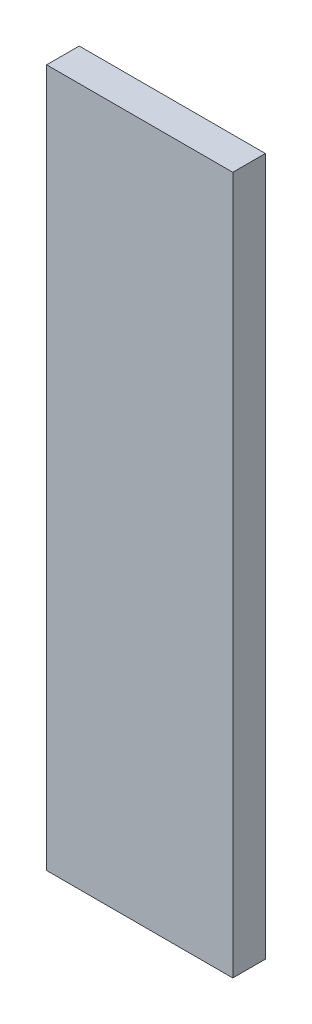
ISO-10303-21;
HEADER;
FILE_DESCRIPTION(('STEP AP214'),'2;1');
FILE_NAME('part.step','',(''),(''),'','','');
FILE_SCHEMA(('AUTOMOTIVE_DESIGN { 1 0 10303 214 1 1 1 1 }'));
ENDSEC;
DATA;
#1=APPLICATION_CONTEXT('core data for automotive mechanical design processes');
#2=APPLICATION_PROTOCOL_DEFINITION('international standard','automotive_design',2000,#1);
#3=PRODUCT_CONTEXT('',#1,'mechanical');
#4=PRODUCT('Part','Part','',(#3));
#5=PRODUCT_RELATED_PRODUCT_CATEGORY('part','',(#4));
#6=PRODUCT_DEFINITION_FORMATION('','',#4);
#7=PRODUCT_DEFINITION_CONTEXT('part definition',#1,'design');
#8=PRODUCT_DEFINITION('design','',#6,#7);
#9=PRODUCT_DEFINITION_SHAPE('','',#8);
#10=(LENGTH_UNIT() NAMED_UNIT(*) SI_UNIT(.MILLI.,.METRE.));
#11=(NAMED_UNIT(*) PLANE_ANGLE_UNIT() SI_UNIT($,.RADIAN.));
#12=(NAMED_UNIT(*) SI_UNIT($,.STERADIAN.) SOLID_ANGLE_UNIT());
#13=UNCERTAINTY_MEASURE_WITH_UNIT(LENGTH_MEASURE(1.E-05),#10,'distance_accuracy_value','');
#14=(GEOMETRIC_REPRESENTATION_CONTEXT(3) GLOBAL_UNCERTAINTY_ASSIGNED_CONTEXT((#13)) GLOBAL_UNIT_ASSIGNED_CONTEXT((#10,
#11,#12)) REPRESENTATION_CONTEXT('',''));
#15=CARTESIAN_POINT('',(0.,0.,0.));
#16=DIRECTION('',(0.,0.,1.));
#17=DIRECTION('',(1.,0.,0.));
#18=AXIS2_PLACEMENT_3D('',#15,#16,#17);
#19=CARTESIAN_POINT('',(-18.13941,68.00215,6.35));
#20=DIRECTION('',(1.,0.,0.));
#21=DIRECTION('',(0.,1.,0.));
#22=AXIS2_PLACEMENT_3D('',#19,#20,#21);
#23=PLANE('',#22);
#24=DIRECTION('',(0.,-1.,0.));
#25=VECTOR('',#24,1.);
#26=CARTESIAN_POINT('',(-18.13941,68.00215,0.));
#27=LINE('',#26,#25);
#28=CARTESIAN_POINT('',(-18.13941,68.00215,0.));
#29=VERTEX_POINT('',#28);
#30=CARTESIAN_POINT('',(-18.13941,-68.00215,0.));
#31=VERTEX_POINT('',#30);
#32=EDGE_CURVE('E114',#29,#31,#27,.T.);
#33=ORIENTED_EDGE('',*,*,#32,.T.);
#34=DIRECTION('',(0.,0.,-1.));
#35=VECTOR('',#34,1.);
#36=CARTESIAN_POINT('',(-18.13941,-68.00215,6.35));
#37=LINE('',#36,#35);
#38=CARTESIAN_POINT('',(-18.13941,-68.00215,6.35));
#39=VERTEX_POINT('',#38);
#40=EDGE_CURVE('E11',#39,#31,#37,.T.);
#41=ORIENTED_EDGE('',*,*,#40,.F.);
#42=DIRECTION('',(0.,-1.,0.));
#43=VECTOR('',#42,1.);
#44=CARTESIAN_POINT('',(-18.13941,68.00215,6.35));
#45=LINE('',#44,#43);
#46=CARTESIAN_POINT('',(-18.13941,68.00215,6.35));
#47=VERTEX_POINT('',#46);
#48=EDGE_CURVE('E115',#47,#39,#45,.T.);
#49=ORIENTED_EDGE('',*,*,#48,.F.);
#50=DIRECTION('',(0.,0.,-1.));
#51=VECTOR('',#50,1.);
#52=CARTESIAN_POINT('',(-18.13941,68.00215,6.35));
#53=LINE('',#52,#51);
#54=EDGE_CURVE('E121',#47,#29,#53,.T.);
#55=ORIENTED_EDGE('',*,*,#54,.T.);
#56=EDGE_LOOP('',(#33,#41,#49,#55));
#57=FACE_BOUND('',#56,.T.);
#58=ADVANCED_FACE('F31',(#57),#23,.F.);
#59=CARTESIAN_POINT('',(-18.13941,-68.00215,6.35));
#60=DIRECTION('',(0.,1.,0.));
#61=DIRECTION('',(0.,0.,1.));
#62=AXIS2_PLACEMENT_3D('',#59,#60,#61);
#63=PLANE('',#62);
#64=CARTESIAN_POINT('',(11.7894100000325,-68.00215,3.1749999999998));
#65=DIRECTION('',(0.,-1.,0.));
#66=DIRECTION('',(0.,0.,-1.));
#67=AXIS2_PLACEMENT_3D('',#64,#65,#66);
#68=CIRCLE('',#67,1.2573);
#69=CARTESIAN_POINT('',(11.7894100000325,-68.00215,1.9176999999998));
#70=VERTEX_POINT('',#69);
#71=EDGE_CURVE('E160',#70,#70,#68,.T.);
#72=ORIENTED_EDGE('',*,*,#71,.F.);
#73=EDGE_LOOP('',(#72));
#74=FACE_BOUND('',#73,.T.);
#75=CARTESIAN_POINT('',(-13.1787899999682,-68.00215,3.1749999999998));
#76=DIRECTION('',(0.,-1.,0.));
#77=DIRECTION('',(0.,0.,-1.));
#78=AXIS2_PLACEMENT_3D('',#75,#76,#77);
#79=CIRCLE('',#78,1.2573);
#80=CARTESIAN_POINT('',(-13.1787899999682,-68.00215,1.9176999999998));
#81=VERTEX_POINT('',#80);
#82=EDGE_CURVE('E95',#81,#81,#79,.T.);
#83=ORIENTED_EDGE('',*,*,#82,.F.);
#84=EDGE_LOOP('',(#83));
#85=FACE_BOUND('',#84,.T.);
#86=DIRECTION('',(1.,0.,0.));
#87=VECTOR('',#86,1.);
#88=CARTESIAN_POINT('',(-18.13941,-68.00215,0.));
#89=LINE('',#88,#87);
#90=CARTESIAN_POINT('',(18.13941,-68.00215,0.));
#91=VERTEX_POINT('',#90);
#92=EDGE_CURVE('E124',#31,#91,#89,.T.);
#93=ORIENTED_EDGE('',*,*,#92,.T.);
#94=DIRECTION('',(0.,0.,-1.));
#95=VECTOR('',#94,1.);
#96=CARTESIAN_POINT('',(18.13941,-68.00215,6.35));
#97=LINE('',#96,#95);
#98=CARTESIAN_POINT('',(18.13941,-68.00215,6.35));
#99=VERTEX_POINT('',#98);
#100=EDGE_CURVE('E39',#99,#91,#97,.T.);
#101=ORIENTED_EDGE('',*,*,#100,.F.);
#102=DIRECTION('',(1.,0.,0.));
#103=VECTOR('',#102,1.);
#104=CARTESIAN_POINT('',(-18.13941,-68.00215,6.35));
#105=LINE('',#104,#103);
#106=EDGE_CURVE('E78',#39,#99,#105,.T.);
#107=ORIENTED_EDGE('',*,*,#106,.F.);
#108=ORIENTED_EDGE('',*,*,#40,.T.);
#109=EDGE_LOOP('',(#93,#101,#107,#108));
#110=FACE_BOUND('',#109,.T.);
#111=ADVANCED_FACE('F147',(#74,#85,#110),#63,.F.);
#112=CARTESIAN_POINT('',(18.13941,68.00215,6.35));
#113=DIRECTION('',(-1.,0.,0.));
#114=DIRECTION('',(0.,-1.,0.));
#115=AXIS2_PLACEMENT_3D('',#112,#113,#114);
#116=PLANE('',#115);
#117=DIRECTION('',(0.,1.,0.));
#118=VECTOR('',#117,1.);
#119=CARTESIAN_POINT('',(18.13941,68.00215,0.));
#120=LINE('',#119,#118);
#121=CARTESIAN_POINT('',(18.13941,68.00215,0.));
#122=VERTEX_POINT('',#121);
#123=EDGE_CURVE('E65',#91,#122,#120,.T.);
#124=ORIENTED_EDGE('',*,*,#123,.T.);
#125=DIRECTION('',(0.,0.,-1.));
#126=VECTOR('',#125,1.);
#127=CARTESIAN_POINT('',(18.13941,68.00215,6.35));
#128=LINE('',#127,#126);
#129=CARTESIAN_POINT('',(18.13941,68.00215,6.35));
#130=VERTEX_POINT('',#129);
#131=EDGE_CURVE('E129',#130,#122,#128,.T.);
#132=ORIENTED_EDGE('',*,*,#131,.F.);
#133=DIRECTION('',(0.,1.,0.));
#134=VECTOR('',#133,1.);
#135=CARTESIAN_POINT('',(18.13941,68.00215,6.35));
#136=LINE('',#135,#134);
#137=EDGE_CURVE('E118',#99,#130,#136,.T.);
#138=ORIENTED_EDGE('',*,*,#137,.F.);
#139=ORIENTED_EDGE('',*,*,#100,.T.);
#140=EDGE_LOOP('',(#124,#132,#138,#139));
#141=FACE_BOUND('',#140,.T.);
#142=ADVANCED_FACE('F131',(#141),#116,.F.);
#143=CARTESIAN_POINT('',(-18.13941,68.00215,6.35));
#144=DIRECTION('',(0.,-1.,0.));
#145=DIRECTION('',(0.,0.,-1.));
#146=AXIS2_PLACEMENT_3D('',#143,#144,#145);
#147=PLANE('',#146);
#148=DIRECTION('',(-1.,0.,0.));
#149=VECTOR('',#148,1.);
#150=CARTESIAN_POINT('',(-18.13941,68.00215,0.));
#151=LINE('',#150,#149);
#152=EDGE_CURVE('E71',#122,#29,#151,.T.);
#153=ORIENTED_EDGE('',*,*,#152,.T.);
#154=ORIENTED_EDGE('',*,*,#54,.F.);
#155=DIRECTION('',(-1.,0.,0.));
#156=VECTOR('',#155,1.);
#157=CARTESIAN_POINT('',(-18.13941,68.00215,6.35));
#158=LINE('',#157,#156);
#159=EDGE_CURVE('E47',#130,#47,#158,.T.);
#160=ORIENTED_EDGE('',*,*,#159,.F.);
#161=ORIENTED_EDGE('',*,*,#131,.T.);
#162=EDGE_LOOP('',(#153,#154,#160,#161));
#163=FACE_BOUND('',#162,.T.);
#164=ADVANCED_FACE('F138',(#163),#147,.F.);
#165=CARTESIAN_POINT('',(-18.13941,-68.00215,6.35));
#166=DIRECTION('',(0.,0.,1.));
#167=DIRECTION('',(1.,0.,0.));
#168=AXIS2_PLACEMENT_3D('',#165,#166,#167);
#169=PLANE('',#168);
#170=ORIENTED_EDGE('',*,*,#48,.T.);
#171=ORIENTED_EDGE('',*,*,#106,.T.);
#172=ORIENTED_EDGE('',*,*,#137,.T.);
#173=ORIENTED_EDGE('',*,*,#159,.T.);
#174=EDGE_LOOP('',(#170,#171,#172,#173));
#175=FACE_BOUND('',#174,.T.);
#176=ADVANCED_FACE('F140',(#175),#169,.T.);
#177=CARTESIAN_POINT('',(-18.13941,-68.00215,0.));
#178=DIRECTION('',(0.,0.,1.));
#179=DIRECTION('',(1.,0.,0.));
#180=AXIS2_PLACEMENT_3D('',#177,#178,#179);
#181=PLANE('',#180);
#182=ORIENTED_EDGE('',*,*,#32,.F.);
#183=ORIENTED_EDGE('',*,*,#152,.F.);
#184=ORIENTED_EDGE('',*,*,#123,.F.);
#185=ORIENTED_EDGE('',*,*,#92,.F.);
#186=EDGE_LOOP('',(#182,#183,#184,#185));
#187=FACE_BOUND('',#186,.T.);
#188=ADVANCED_FACE('F134',(#187),#181,.F.);
#189=CARTESIAN_POINT('',(-13.1787899999682,-58.85815,3.1749999999998));
#190=DIRECTION('',(0.,-1.,0.));
#191=DIRECTION('',(0.,0.,-1.));
#192=AXIS2_PLACEMENT_3D('',#189,#190,#191);
#193=CONICAL_SURFACE('',#192,0.996949999999996,1.02974425867665);
#194=CARTESIAN_POINT('',(-13.1787899999682,-58.2591220058605,3.1749999999998));
#195=VERTEX_POINT('',#194);
#196=VERTEX_LOOP('',#195);
#197=FACE_BOUND('',#196,.T.);
#198=CARTESIAN_POINT('',(-13.1787899999682,-58.85815,3.1749999999998));
#199=DIRECTION('',(0.,-1.,0.));
#200=DIRECTION('',(0.,0.,-1.));
#201=AXIS2_PLACEMENT_3D('',#198,#199,#200);
#202=CIRCLE('',#201,0.996949999999996);
#203=CARTESIAN_POINT('',(-13.1787899999682,-58.85815,2.17804999999981));
#204=VERTEX_POINT('',#203);
#205=EDGE_CURVE('E111',#204,#204,#202,.T.);
#206=ORIENTED_EDGE('',*,*,#205,.T.);
#207=EDGE_LOOP('',(#206));
#208=FACE_BOUND('',#207,.T.);
#209=ADVANCED_FACE('F178',(#197,#208),#193,.F.);
#210=CARTESIAN_POINT('',(-13.1787899999682,-68.00215,3.1749999999998));
#211=DIRECTION('',(0.,-1.,0.));
#212=DIRECTION('',(0.,0.,-1.));
#213=AXIS2_PLACEMENT_3D('',#210,#211,#212);
#214=CYLINDRICAL_SURFACE('',#213,0.996949999999998);
#215=ORIENTED_EDGE('',*,*,#205,.F.);
#216=EDGE_LOOP('',(#215));
#217=FACE_BOUND('',#216,.T.);
#218=CARTESIAN_POINT('',(-13.1787899999682,-60.38215,3.1749999999998));
#219=DIRECTION('',(0.,-1.,0.));
#220=DIRECTION('',(0.,0.,-1.));
#221=AXIS2_PLACEMENT_3D('',#218,#219,#220);
#222=CIRCLE('',#221,0.99695);
#223=CARTESIAN_POINT('',(-13.1787899999682,-60.38215,2.1780499999998));
#224=VERTEX_POINT('',#223);
#225=EDGE_CURVE('E108',#224,#224,#222,.T.);
#226=ORIENTED_EDGE('',*,*,#225,.T.);
#227=EDGE_LOOP('',(#226));
#228=FACE_BOUND('',#227,.T.);
#229=ADVANCED_FACE('F170',(#217,#228),#214,.F.);
#230=CARTESIAN_POINT('',(-12.1818399999682,-60.38215,3.1749999999998));
#231=DIRECTION('',(0.,1.,0.));
#232=DIRECTION('',(0.,0.,1.));
#233=AXIS2_PLACEMENT_3D('',#230,#231,#232);
#234=PLANE('',#233);
#235=ORIENTED_EDGE('',*,*,#225,.F.);
#236=EDGE_LOOP('',(#235));
#237=FACE_BOUND('',#236,.T.);
#238=CARTESIAN_POINT('',(-13.1787899999682,-60.38215,3.1749999999998));
#239=DIRECTION('',(0.,-1.,0.));
#240=DIRECTION('',(0.,0.,-1.));
#241=AXIS2_PLACEMENT_3D('',#238,#239,#240);
#242=CIRCLE('',#241,1.2573);
#243=CARTESIAN_POINT('',(-13.1787899999682,-60.38215,1.9176999999998));
#244=VERTEX_POINT('',#243);
#245=EDGE_CURVE('E99',#244,#244,#242,.T.);
#246=ORIENTED_EDGE('',*,*,#245,.T.);
#247=EDGE_LOOP('',(#246));
#248=FACE_BOUND('',#247,.T.);
#249=ADVANCED_FACE('F164',(#237,#248),#234,.F.);
#250=CARTESIAN_POINT('',(-13.1787899999682,-68.00215,3.1749999999998));
#251=DIRECTION('',(0.,-1.,0.));
#252=DIRECTION('',(0.,0.,-1.));
#253=AXIS2_PLACEMENT_3D('',#250,#251,#252);
#254=CYLINDRICAL_SURFACE('',#253,1.2573);
#255=ORIENTED_EDGE('',*,*,#245,.F.);
#256=EDGE_LOOP('',(#255));
#257=FACE_BOUND('',#256,.T.);
#258=ORIENTED_EDGE('',*,*,#82,.T.);
#259=EDGE_LOOP('',(#258));
#260=FACE_BOUND('',#259,.T.);
#261=ADVANCED_FACE('F89',(#257,#260),#254,.F.);
#262=CARTESIAN_POINT('',(11.7894100000325,-58.85815,3.1749999999998));
#263=DIRECTION('',(0.,-1.,0.));
#264=DIRECTION('',(0.,0.,-1.));
#265=AXIS2_PLACEMENT_3D('',#262,#263,#264);
#266=CONICAL_SURFACE('',#265,0.996949999999996,1.02974425867665);
#267=CARTESIAN_POINT('',(11.7894100000325,-58.2591220058605,3.1749999999998));
#268=VERTEX_POINT('',#267);
#269=VERTEX_LOOP('',#268);
#270=FACE_BOUND('',#269,.T.);
#271=CARTESIAN_POINT('',(11.7894100000325,-58.85815,3.1749999999998));
#272=DIRECTION('',(0.,-1.,0.));
#273=DIRECTION('',(0.,0.,-1.));
#274=AXIS2_PLACEMENT_3D('',#271,#272,#273);
#275=CIRCLE('',#274,0.996949999999996);
#276=CARTESIAN_POINT('',(11.7894100000325,-58.85815,2.17804999999981));
#277=VERTEX_POINT('',#276);
#278=EDGE_CURVE('E93',#277,#277,#275,.T.);
#279=ORIENTED_EDGE('',*,*,#278,.T.);
#280=EDGE_LOOP('',(#279));
#281=FACE_BOUND('',#280,.T.);
#282=ADVANCED_FACE('F85',(#270,#281),#266,.F.);
#283=CARTESIAN_POINT('',(11.7894100000325,-68.00215,3.1749999999998));
#284=DIRECTION('',(0.,-1.,0.));
#285=DIRECTION('',(0.,0.,-1.));
#286=AXIS2_PLACEMENT_3D('',#283,#284,#285);
#287=CYLINDRICAL_SURFACE('',#286,0.996949999999998);
#288=ORIENTED_EDGE('',*,*,#278,.F.);
#289=EDGE_LOOP('',(#288));
#290=FACE_BOUND('',#289,.T.);
#291=CARTESIAN_POINT('',(11.7894100000325,-60.38215,3.1749999999998));
#292=DIRECTION('',(0.,-1.,0.));
#293=DIRECTION('',(0.,0.,-1.));
#294=AXIS2_PLACEMENT_3D('',#291,#292,#293);
#295=CIRCLE('',#294,0.99695);
#296=CARTESIAN_POINT('',(11.7894100000325,-60.38215,2.1780499999998));
#297=VERTEX_POINT('',#296);
#298=EDGE_CURVE('E96',#297,#297,#295,.T.);
#299=ORIENTED_EDGE('',*,*,#298,.T.);
#300=EDGE_LOOP('',(#299));
#301=FACE_BOUND('',#300,.T.);
#302=ADVANCED_FACE('F88',(#290,#301),#287,.F.);
#303=CARTESIAN_POINT('',(12.7863600000325,-60.38215,3.1749999999998));
#304=DIRECTION('',(0.,1.,0.));
#305=DIRECTION('',(0.,0.,1.));
#306=AXIS2_PLACEMENT_3D('',#303,#304,#305);
#307=PLANE('',#306);
#308=ORIENTED_EDGE('',*,*,#298,.F.);
#309=EDGE_LOOP('',(#308));
#310=FACE_BOUND('',#309,.T.);
#311=CARTESIAN_POINT('',(11.7894100000325,-60.38215,3.1749999999998));
#312=DIRECTION('',(0.,-1.,0.));
#313=DIRECTION('',(0.,0.,-1.));
#314=AXIS2_PLACEMENT_3D('',#311,#312,#313);
#315=CIRCLE('',#314,1.2573);
#316=CARTESIAN_POINT('',(11.7894100000325,-60.38215,1.9176999999998));
#317=VERTEX_POINT('',#316);
#318=EDGE_CURVE('E102',#317,#317,#315,.T.);
#319=ORIENTED_EDGE('',*,*,#318,.T.);
#320=EDGE_LOOP('',(#319));
#321=FACE_BOUND('',#320,.T.);
#322=ADVANCED_FACE('F218',(#310,#321),#307,.F.);
#323=CARTESIAN_POINT('',(11.7894100000325,-68.00215,3.1749999999998));
#324=DIRECTION('',(0.,-1.,0.));
#325=DIRECTION('',(0.,0.,-1.));
#326=AXIS2_PLACEMENT_3D('',#323,#324,#325);
#327=CYLINDRICAL_SURFACE('',#326,1.2573);
#328=ORIENTED_EDGE('',*,*,#318,.F.);
#329=EDGE_LOOP('',(#328));
#330=FACE_BOUND('',#329,.T.);
#331=ORIENTED_EDGE('',*,*,#71,.T.);
#332=EDGE_LOOP('',(#331));
#333=FACE_BOUND('',#332,.T.);
#334=ADVANCED_FACE('F226',(#330,#333),#327,.F.);
#335=CLOSED_SHELL('',(#58,#111,#142,#164,#176,#188,#209,#229,#249,#261,#282,#302,#322,#334));
#336=MANIFOLD_SOLID_BREP('B2',#335);
#337=ADVANCED_BREP_SHAPE_REPRESENTATION('',(#18,#336),#14);
#338=SHAPE_DEFINITION_REPRESENTATION(#9,#337);
ENDSEC;
END-ISO-10303-21;
